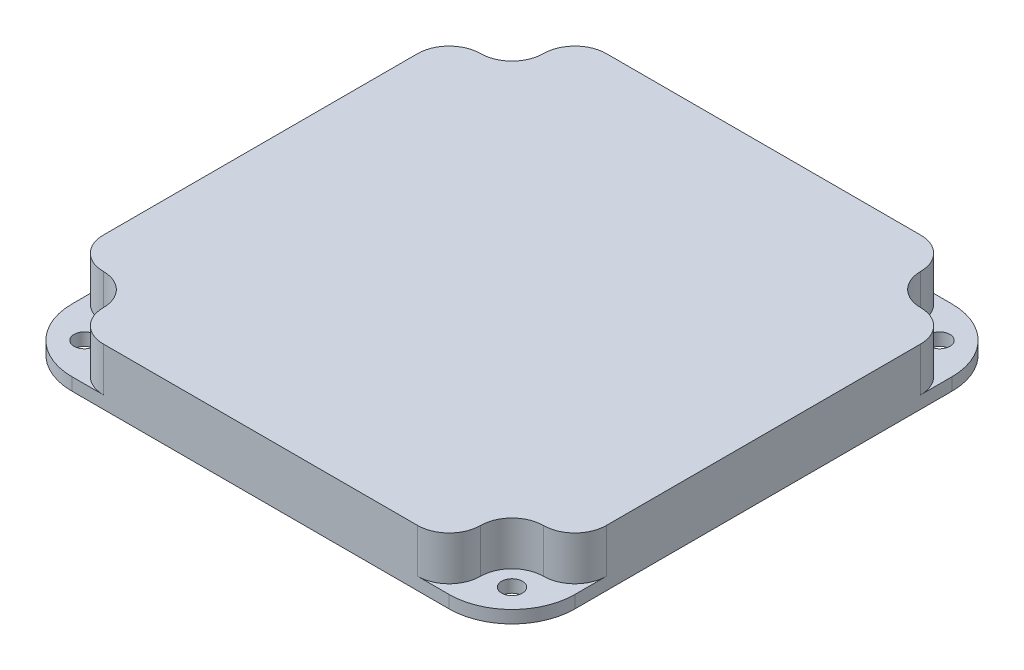
ISO-10303-21;
HEADER;
FILE_DESCRIPTION(('STEP AP214'),'2;1');
FILE_NAME('part.step','',(''),(''),'','','');
FILE_SCHEMA(('AUTOMOTIVE_DESIGN { 1 0 10303 214 1 1 1 1 }'));
ENDSEC;
DATA;
#1=APPLICATION_CONTEXT('core data for automotive mechanical design processes');
#2=APPLICATION_PROTOCOL_DEFINITION('international standard','automotive_design',2000,#1);
#3=PRODUCT_CONTEXT('',#1,'mechanical');
#4=PRODUCT('Part','Part','',(#3));
#5=PRODUCT_RELATED_PRODUCT_CATEGORY('part','',(#4));
#6=PRODUCT_DEFINITION_FORMATION('','',#4);
#7=PRODUCT_DEFINITION_CONTEXT('part definition',#1,'design');
#8=PRODUCT_DEFINITION('design','',#6,#7);
#9=PRODUCT_DEFINITION_SHAPE('','',#8);
#10=(LENGTH_UNIT() NAMED_UNIT(*) SI_UNIT(.MILLI.,.METRE.));
#11=(NAMED_UNIT(*) PLANE_ANGLE_UNIT() SI_UNIT($,.RADIAN.));
#12=(NAMED_UNIT(*) SI_UNIT($,.STERADIAN.) SOLID_ANGLE_UNIT());
#13=UNCERTAINTY_MEASURE_WITH_UNIT(LENGTH_MEASURE(1.E-05),#10,'distance_accuracy_value','');
#14=(GEOMETRIC_REPRESENTATION_CONTEXT(3) GLOBAL_UNCERTAINTY_ASSIGNED_CONTEXT((#13)) GLOBAL_UNIT_ASSIGNED_CONTEXT((#10,
#11,#12)) REPRESENTATION_CONTEXT('',''));
#15=CARTESIAN_POINT('',(0.,0.,0.));
#16=DIRECTION('',(0.,0.,1.));
#17=DIRECTION('',(1.,0.,0.));
#18=AXIS2_PLACEMENT_3D('',#15,#16,#17);
#19=CARTESIAN_POINT('',(-30.,2.,-30.));
#20=DIRECTION('',(0.,-1.,0.));
#21=DIRECTION('',(0.,0.,-1.));
#22=AXIS2_PLACEMENT_3D('',#19,#20,#21);
#23=PLANE('',#22);
#24=CARTESIAN_POINT('',(34.,2.,-34.));
#25=DIRECTION('',(0.,1.,0.));
#26=DIRECTION('',(0.,0.,-1.));
#27=AXIS2_PLACEMENT_3D('',#24,#25,#26);
#28=CIRCLE('',#27,1.65);
#29=CARTESIAN_POINT('',(34.,2.,-35.65));
#30=VERTEX_POINT('',#29);
#31=EDGE_CURVE('E374',#30,#30,#28,.T.);
#32=ORIENTED_EDGE('',*,*,#31,.F.);
#33=EDGE_LOOP('',(#32));
#34=FACE_BOUND('',#33,.T.);
#35=CARTESIAN_POINT('',(30.,2.,-30.));
#36=DIRECTION('',(0.,1.,0.));
#37=DIRECTION('',(0.,0.,-1.));
#38=AXIS2_PLACEMENT_3D('',#35,#36,#37);
#39=CIRCLE('',#38,10.);
#40=CARTESIAN_POINT('',(40.,2.,-29.9999999999999));
#41=VERTEX_POINT('',#40);
#42=CARTESIAN_POINT('',(29.9999999999999,2.,-40.));
#43=VERTEX_POINT('',#42);
#44=EDGE_CURVE('E394',#41,#43,#39,.T.);
#45=ORIENTED_EDGE('',*,*,#44,.T.);
#46=DIRECTION('',(1.,0.,0.));
#47=VECTOR('',#46,1.);
#48=CARTESIAN_POINT('',(-29.9999999999999,2.,-40.));
#49=LINE('',#48,#47);
#50=CARTESIAN_POINT('',(25.,2.,-40.));
#51=VERTEX_POINT('',#50);
#52=EDGE_CURVE('E263',#51,#43,#49,.T.);
#53=ORIENTED_EDGE('',*,*,#52,.F.);
#54=CARTESIAN_POINT('',(25.,2.,-35.));
#55=DIRECTION('',(0.,-1.,0.));
#56=DIRECTION('',(0.,0.,-1.));
#57=AXIS2_PLACEMENT_3D('',#54,#55,#56);
#58=CIRCLE('',#57,5.);
#59=CARTESIAN_POINT('',(30.,2.,-34.9999999999999));
#60=VERTEX_POINT('',#59);
#61=EDGE_CURVE('E301',#51,#60,#58,.T.);
#62=ORIENTED_EDGE('',*,*,#61,.T.);
#63=CARTESIAN_POINT('',(35.,2.,-35.));
#64=DIRECTION('',(0.,-1.,0.));
#65=DIRECTION('',(0.,0.,-1.));
#66=AXIS2_PLACEMENT_3D('',#63,#64,#65);
#67=CIRCLE('',#66,5.);
#68=CARTESIAN_POINT('',(34.9999999999999,2.,-30.));
#69=VERTEX_POINT('',#68);
#70=EDGE_CURVE('E271',#60,#69,#67,.F.);
#71=ORIENTED_EDGE('',*,*,#70,.T.);
#72=CARTESIAN_POINT('',(35.,2.,-25.));
#73=DIRECTION('',(0.,-1.,0.));
#74=DIRECTION('',(0.,0.,-1.));
#75=AXIS2_PLACEMENT_3D('',#72,#73,#74);
#76=CIRCLE('',#75,5.);
#77=CARTESIAN_POINT('',(40.,2.,-25.));
#78=VERTEX_POINT('',#77);
#79=EDGE_CURVE('E305',#69,#78,#76,.T.);
#80=ORIENTED_EDGE('',*,*,#79,.T.);
#81=DIRECTION('',(0.,0.,1.));
#82=VECTOR('',#81,1.);
#83=CARTESIAN_POINT('',(40.,2.,29.9999999999999));
#84=LINE('',#83,#82);
#85=EDGE_CURVE('E280',#41,#78,#84,.T.);
#86=ORIENTED_EDGE('',*,*,#85,.F.);
#87=EDGE_LOOP('',(#45,#53,#62,#71,#80,#86));
#88=FACE_BOUND('',#87,.T.);
#89=ADVANCED_FACE('F43',(#34,#88),#23,.F.);
#90=CARTESIAN_POINT('',(34.,2.,34.));
#91=DIRECTION('',(0.,1.,0.));
#92=DIRECTION('',(0.,0.,1.));
#93=AXIS2_PLACEMENT_3D('',#90,#91,#92);
#94=CIRCLE('',#93,1.65);
#95=CARTESIAN_POINT('',(34.,2.,35.65));
#96=VERTEX_POINT('',#95);
#97=EDGE_CURVE('E368',#96,#96,#94,.T.);
#98=ORIENTED_EDGE('',*,*,#97,.F.);
#99=EDGE_LOOP('',(#98));
#100=FACE_BOUND('',#99,.T.);
#101=CARTESIAN_POINT('',(30.,2.,30.));
#102=DIRECTION('',(0.,1.,0.));
#103=DIRECTION('',(0.,0.,1.));
#104=AXIS2_PLACEMENT_3D('',#101,#102,#103);
#105=CIRCLE('',#104,10.);
#106=CARTESIAN_POINT('',(29.9999999999999,2.,40.));
#107=VERTEX_POINT('',#106);
#108=CARTESIAN_POINT('',(40.,2.,29.9999999999999));
#109=VERTEX_POINT('',#108);
#110=EDGE_CURVE('E392',#107,#109,#105,.T.);
#111=ORIENTED_EDGE('',*,*,#110,.T.);
#112=DIRECTION('',(0.,0.,1.));
#113=VECTOR('',#112,1.);
#114=CARTESIAN_POINT('',(40.,2.,29.9999999999999));
#115=LINE('',#114,#113);
#116=CARTESIAN_POINT('',(40.,2.,25.));
#117=VERTEX_POINT('',#116);
#118=EDGE_CURVE('E273',#117,#109,#115,.T.);
#119=ORIENTED_EDGE('',*,*,#118,.F.);
#120=CARTESIAN_POINT('',(35.,2.,25.));
#121=DIRECTION('',(0.,-1.,0.));
#122=DIRECTION('',(0.,0.,-1.));
#123=AXIS2_PLACEMENT_3D('',#120,#121,#122);
#124=CIRCLE('',#123,5.);
#125=CARTESIAN_POINT('',(34.9999999999999,2.,30.));
#126=VERTEX_POINT('',#125);
#127=EDGE_CURVE('E307',#117,#126,#124,.T.);
#128=ORIENTED_EDGE('',*,*,#127,.T.);
#129=CARTESIAN_POINT('',(35.,2.,35.));
#130=DIRECTION('',(0.,-1.,0.));
#131=DIRECTION('',(0.,0.,-1.));
#132=AXIS2_PLACEMENT_3D('',#129,#130,#131);
#133=CIRCLE('',#132,5.);
#134=CARTESIAN_POINT('',(30.,2.,34.9999999999999));
#135=VERTEX_POINT('',#134);
#136=EDGE_CURVE('E283',#126,#135,#133,.F.);
#137=ORIENTED_EDGE('',*,*,#136,.T.);
#138=CARTESIAN_POINT('',(25.,2.,35.));
#139=DIRECTION('',(0.,-1.,0.));
#140=DIRECTION('',(0.,0.,-1.));
#141=AXIS2_PLACEMENT_3D('',#138,#139,#140);
#142=CIRCLE('',#141,5.);
#143=CARTESIAN_POINT('',(25.,2.,40.));
#144=VERTEX_POINT('',#143);
#145=EDGE_CURVE('E311',#135,#144,#142,.T.);
#146=ORIENTED_EDGE('',*,*,#145,.T.);
#147=DIRECTION('',(-1.,0.,0.));
#148=VECTOR('',#147,1.);
#149=CARTESIAN_POINT('',(-29.9999999999999,2.,40.));
#150=LINE('',#149,#148);
#151=EDGE_CURVE('E68',#107,#144,#150,.T.);
#152=ORIENTED_EDGE('',*,*,#151,.F.);
#153=EDGE_LOOP('',(#111,#119,#128,#137,#146,#152));
#154=FACE_BOUND('',#153,.T.);
#155=ADVANCED_FACE('F446',(#100,#154),#23,.F.);
#156=CARTESIAN_POINT('',(-34.,2.,34.));
#157=DIRECTION('',(0.,1.,0.));
#158=DIRECTION('',(0.,0.,-1.));
#159=AXIS2_PLACEMENT_3D('',#156,#157,#158);
#160=CIRCLE('',#159,1.65);
#161=CARTESIAN_POINT('',(-34.,2.,32.35));
#162=VERTEX_POINT('',#161);
#163=EDGE_CURVE('E380',#162,#162,#160,.T.);
#164=ORIENTED_EDGE('',*,*,#163,.F.);
#165=EDGE_LOOP('',(#164));
#166=FACE_BOUND('',#165,.T.);
#167=CARTESIAN_POINT('',(-30.,2.,30.));
#168=DIRECTION('',(0.,1.,0.));
#169=DIRECTION('',(0.,0.,-1.));
#170=AXIS2_PLACEMENT_3D('',#167,#168,#169);
#171=CIRCLE('',#170,10.);
#172=CARTESIAN_POINT('',(-40.,2.,29.9999999999999));
#173=VERTEX_POINT('',#172);
#174=CARTESIAN_POINT('',(-29.9999999999999,2.,40.));
#175=VERTEX_POINT('',#174);
#176=EDGE_CURVE('E227',#173,#175,#171,.T.);
#177=ORIENTED_EDGE('',*,*,#176,.T.);
#178=DIRECTION('',(-1.,0.,0.));
#179=VECTOR('',#178,1.);
#180=CARTESIAN_POINT('',(-29.9999999999999,2.,40.));
#181=LINE('',#180,#179);
#182=CARTESIAN_POINT('',(-25.,2.,40.));
#183=VERTEX_POINT('',#182);
#184=EDGE_CURVE('E285',#183,#175,#181,.T.);
#185=ORIENTED_EDGE('',*,*,#184,.F.);
#186=CARTESIAN_POINT('',(-25.,2.,35.));
#187=DIRECTION('',(0.,-1.,0.));
#188=DIRECTION('',(0.,0.,-1.));
#189=AXIS2_PLACEMENT_3D('',#186,#187,#188);
#190=CIRCLE('',#189,5.);
#191=CARTESIAN_POINT('',(-30.,2.,34.9999999999999));
#192=VERTEX_POINT('',#191);
#193=EDGE_CURVE('E11',#183,#192,#190,.T.);
#194=ORIENTED_EDGE('',*,*,#193,.T.);
#195=CARTESIAN_POINT('',(-35.,2.,35.));
#196=DIRECTION('',(0.,-1.,0.));
#197=DIRECTION('',(0.,0.,-1.));
#198=AXIS2_PLACEMENT_3D('',#195,#196,#197);
#199=CIRCLE('',#198,5.);
#200=CARTESIAN_POINT('',(-34.9999999999999,2.,30.));
#201=VERTEX_POINT('',#200);
#202=EDGE_CURVE('E293',#192,#201,#199,.F.);
#203=ORIENTED_EDGE('',*,*,#202,.T.);
#204=CARTESIAN_POINT('',(-35.,2.,25.));
#205=DIRECTION('',(0.,-1.,0.));
#206=DIRECTION('',(0.,0.,-1.));
#207=AXIS2_PLACEMENT_3D('',#204,#205,#206);
#208=CIRCLE('',#207,5.);
#209=CARTESIAN_POINT('',(-40.,2.,25.));
#210=VERTEX_POINT('',#209);
#211=EDGE_CURVE('E313',#201,#210,#208,.T.);
#212=ORIENTED_EDGE('',*,*,#211,.T.);
#213=DIRECTION('',(0.,0.,-1.));
#214=VECTOR('',#213,1.);
#215=CARTESIAN_POINT('',(-40.,2.,29.9999999999999));
#216=LINE('',#215,#214);
#217=EDGE_CURVE('E60',#173,#210,#216,.T.);
#218=ORIENTED_EDGE('',*,*,#217,.F.);
#219=EDGE_LOOP('',(#177,#185,#194,#203,#212,#218));
#220=FACE_BOUND('',#219,.T.);
#221=ADVANCED_FACE('F448',(#166,#220),#23,.F.);
#222=CARTESIAN_POINT('',(-34.,2.,-34.));
#223=DIRECTION('',(0.,1.,0.));
#224=DIRECTION('',(0.,0.,1.));
#225=AXIS2_PLACEMENT_3D('',#222,#223,#224);
#226=CIRCLE('',#225,1.65);
#227=CARTESIAN_POINT('',(-34.,2.,-32.35));
#228=VERTEX_POINT('',#227);
#229=EDGE_CURVE('E386',#228,#228,#226,.T.);
#230=ORIENTED_EDGE('',*,*,#229,.F.);
#231=EDGE_LOOP('',(#230));
#232=FACE_BOUND('',#231,.T.);
#233=CARTESIAN_POINT('',(-30.,2.,-30.));
#234=DIRECTION('',(0.,1.,0.));
#235=DIRECTION('',(0.,0.,-1.));
#236=AXIS2_PLACEMENT_3D('',#233,#234,#235);
#237=CIRCLE('',#236,10.);
#238=CARTESIAN_POINT('',(-29.9999999999999,2.,-40.));
#239=VERTEX_POINT('',#238);
#240=CARTESIAN_POINT('',(-40.,2.,-29.9999999999999));
#241=VERTEX_POINT('',#240);
#242=EDGE_CURVE('E220',#239,#241,#237,.T.);
#243=ORIENTED_EDGE('',*,*,#242,.T.);
#244=DIRECTION('',(0.,0.,-1.));
#245=VECTOR('',#244,1.);
#246=CARTESIAN_POINT('',(-40.,2.,29.9999999999999));
#247=LINE('',#246,#245);
#248=CARTESIAN_POINT('',(-40.,2.,-25.));
#249=VERTEX_POINT('',#248);
#250=EDGE_CURVE('E208',#249,#241,#247,.T.);
#251=ORIENTED_EDGE('',*,*,#250,.F.);
#252=CARTESIAN_POINT('',(-35.,2.,-25.));
#253=DIRECTION('',(0.,-1.,0.));
#254=DIRECTION('',(0.,0.,-1.));
#255=AXIS2_PLACEMENT_3D('',#252,#253,#254);
#256=CIRCLE('',#255,5.);
#257=CARTESIAN_POINT('',(-34.9999999999999,2.,-30.));
#258=VERTEX_POINT('',#257);
#259=EDGE_CURVE('E295',#249,#258,#256,.T.);
#260=ORIENTED_EDGE('',*,*,#259,.T.);
#261=CARTESIAN_POINT('',(-35.,2.,-35.));
#262=DIRECTION('',(0.,-1.,0.));
#263=DIRECTION('',(0.,0.,-1.));
#264=AXIS2_PLACEMENT_3D('',#261,#262,#263);
#265=CIRCLE('',#264,5.);
#266=CARTESIAN_POINT('',(-30.,2.,-34.9999999999999));
#267=VERTEX_POINT('',#266);
#268=EDGE_CURVE('E261',#258,#267,#265,.F.);
#269=ORIENTED_EDGE('',*,*,#268,.T.);
#270=CARTESIAN_POINT('',(-25.,2.,-35.));
#271=DIRECTION('',(0.,-1.,0.));
#272=DIRECTION('',(0.,0.,-1.));
#273=AXIS2_PLACEMENT_3D('',#270,#271,#272);
#274=CIRCLE('',#273,5.);
#275=CARTESIAN_POINT('',(-25.,2.,-40.));
#276=VERTEX_POINT('',#275);
#277=EDGE_CURVE('E299',#267,#276,#274,.T.);
#278=ORIENTED_EDGE('',*,*,#277,.T.);
#279=DIRECTION('',(1.,0.,0.));
#280=VECTOR('',#279,1.);
#281=CARTESIAN_POINT('',(-29.9999999999999,2.,-40.));
#282=LINE('',#281,#280);
#283=EDGE_CURVE('E223',#239,#276,#282,.T.);
#284=ORIENTED_EDGE('',*,*,#283,.F.);
#285=EDGE_LOOP('',(#243,#251,#260,#269,#278,#284));
#286=FACE_BOUND('',#285,.T.);
#287=ADVANCED_FACE('F221',(#232,#286),#23,.F.);
#288=CARTESIAN_POINT('',(-30.,0.,-30.));
#289=DIRECTION('',(0.,-1.,0.));
#290=DIRECTION('',(0.,0.,-1.));
#291=AXIS2_PLACEMENT_3D('',#288,#289,#290);
#292=PLANE('',#291);
#293=CARTESIAN_POINT('',(34.,0.,-34.));
#294=DIRECTION('',(0.,1.,0.));
#295=DIRECTION('',(0.,0.,-1.));
#296=AXIS2_PLACEMENT_3D('',#293,#294,#295);
#297=CIRCLE('',#296,1.65);
#298=CARTESIAN_POINT('',(34.,0.,-35.65));
#299=VERTEX_POINT('',#298);
#300=EDGE_CURVE('E371',#299,#299,#297,.T.);
#301=ORIENTED_EDGE('',*,*,#300,.T.);
#302=EDGE_LOOP('',(#301));
#303=FACE_BOUND('',#302,.T.);
#304=CARTESIAN_POINT('',(-34.,0.,-34.));
#305=DIRECTION('',(0.,1.,0.));
#306=DIRECTION('',(0.,0.,1.));
#307=AXIS2_PLACEMENT_3D('',#304,#305,#306);
#308=CIRCLE('',#307,1.65);
#309=CARTESIAN_POINT('',(-34.,0.,-32.35));
#310=VERTEX_POINT('',#309);
#311=EDGE_CURVE('E383',#310,#310,#308,.T.);
#312=ORIENTED_EDGE('',*,*,#311,.T.);
#313=EDGE_LOOP('',(#312));
#314=FACE_BOUND('',#313,.T.);
#315=CARTESIAN_POINT('',(-30.,0.,-30.));
#316=DIRECTION('',(0.,1.,0.));
#317=DIRECTION('',(0.,0.,-1.));
#318=AXIS2_PLACEMENT_3D('',#315,#316,#317);
#319=CIRCLE('',#318,10.);
#320=CARTESIAN_POINT('',(-29.9999999999999,0.,-40.));
#321=VERTEX_POINT('',#320);
#322=CARTESIAN_POINT('',(-40.,0.,-29.9999999999999));
#323=VERTEX_POINT('',#322);
#324=EDGE_CURVE('E232',#321,#323,#319,.T.);
#325=ORIENTED_EDGE('',*,*,#324,.F.);
#326=DIRECTION('',(-1.,0.,0.));
#327=VECTOR('',#326,1.);
#328=CARTESIAN_POINT('',(-29.9999999999999,0.,-40.));
#329=LINE('',#328,#327);
#330=CARTESIAN_POINT('',(29.9999999999999,0.,-40.));
#331=VERTEX_POINT('',#330);
#332=EDGE_CURVE('E228',#331,#321,#329,.T.);
#333=ORIENTED_EDGE('',*,*,#332,.F.);
#334=CARTESIAN_POINT('',(30.,0.,-30.));
#335=DIRECTION('',(0.,1.,0.));
#336=DIRECTION('',(0.,0.,-1.));
#337=AXIS2_PLACEMENT_3D('',#334,#335,#336);
#338=CIRCLE('',#337,10.);
#339=CARTESIAN_POINT('',(40.,0.,-29.9999999999999));
#340=VERTEX_POINT('',#339);
#341=EDGE_CURVE('E409',#340,#331,#338,.T.);
#342=ORIENTED_EDGE('',*,*,#341,.F.);
#343=DIRECTION('',(0.,0.,-1.));
#344=VECTOR('',#343,1.);
#345=CARTESIAN_POINT('',(40.,0.,29.9999999999999));
#346=LINE('',#345,#344);
#347=CARTESIAN_POINT('',(40.,0.,29.9999999999999));
#348=VERTEX_POINT('',#347);
#349=EDGE_CURVE('E407',#348,#340,#346,.T.);
#350=ORIENTED_EDGE('',*,*,#349,.F.);
#351=CARTESIAN_POINT('',(30.,0.,30.));
#352=DIRECTION('',(0.,1.,0.));
#353=DIRECTION('',(0.,0.,1.));
#354=AXIS2_PLACEMENT_3D('',#351,#352,#353);
#355=CIRCLE('',#354,10.);
#356=CARTESIAN_POINT('',(29.9999999999999,0.,40.));
#357=VERTEX_POINT('',#356);
#358=EDGE_CURVE('E405',#357,#348,#355,.T.);
#359=ORIENTED_EDGE('',*,*,#358,.F.);
#360=DIRECTION('',(1.,0.,0.));
#361=VECTOR('',#360,1.);
#362=CARTESIAN_POINT('',(-29.9999999999999,0.,40.));
#363=LINE('',#362,#361);
#364=CARTESIAN_POINT('',(-29.9999999999999,0.,40.));
#365=VERTEX_POINT('',#364);
#366=EDGE_CURVE('E403',#365,#357,#363,.T.);
#367=ORIENTED_EDGE('',*,*,#366,.F.);
#368=CARTESIAN_POINT('',(-30.,0.,30.));
#369=DIRECTION('',(0.,1.,0.));
#370=DIRECTION('',(0.,0.,-1.));
#371=AXIS2_PLACEMENT_3D('',#368,#369,#370);
#372=CIRCLE('',#371,10.);
#373=CARTESIAN_POINT('',(-40.,0.,29.9999999999999));
#374=VERTEX_POINT('',#373);
#375=EDGE_CURVE('E401',#374,#365,#372,.T.);
#376=ORIENTED_EDGE('',*,*,#375,.F.);
#377=DIRECTION('',(0.,0.,1.));
#378=VECTOR('',#377,1.);
#379=CARTESIAN_POINT('',(-40.,0.,29.9999999999999));
#380=LINE('',#379,#378);
#381=EDGE_CURVE('E399',#323,#374,#380,.T.);
#382=ORIENTED_EDGE('',*,*,#381,.F.);
#383=EDGE_LOOP('',(#325,#333,#342,#350,#359,#367,#376,#382));
#384=FACE_BOUND('',#383,.T.);
#385=CARTESIAN_POINT('',(-34.,0.,34.));
#386=DIRECTION('',(0.,1.,0.));
#387=DIRECTION('',(0.,0.,-1.));
#388=AXIS2_PLACEMENT_3D('',#385,#386,#387);
#389=CIRCLE('',#388,1.65);
#390=CARTESIAN_POINT('',(-34.,0.,32.35));
#391=VERTEX_POINT('',#390);
#392=EDGE_CURVE('E377',#391,#391,#389,.T.);
#393=ORIENTED_EDGE('',*,*,#392,.T.);
#394=EDGE_LOOP('',(#393));
#395=FACE_BOUND('',#394,.T.);
#396=CARTESIAN_POINT('',(34.,0.,34.));
#397=DIRECTION('',(0.,1.,0.));
#398=DIRECTION('',(0.,0.,1.));
#399=AXIS2_PLACEMENT_3D('',#396,#397,#398);
#400=CIRCLE('',#399,1.65);
#401=CARTESIAN_POINT('',(34.,0.,35.65));
#402=VERTEX_POINT('',#401);
#403=EDGE_CURVE('E362',#402,#402,#400,.T.);
#404=ORIENTED_EDGE('',*,*,#403,.T.);
#405=EDGE_LOOP('',(#404));
#406=FACE_BOUND('',#405,.T.);
#407=ADVANCED_FACE('F432',(#303,#314,#384,#395,#406),#292,.T.);
#408=CARTESIAN_POINT('',(-30.,2.,-30.));
#409=DIRECTION('',(0.,-1.,0.));
#410=DIRECTION('',(0.,0.,-1.));
#411=AXIS2_PLACEMENT_3D('',#408,#409,#410);
#412=CYLINDRICAL_SURFACE('',#411,10.);
#413=ORIENTED_EDGE('',*,*,#324,.T.);
#414=DIRECTION('',(0.,-1.,0.));
#415=VECTOR('',#414,1.);
#416=CARTESIAN_POINT('',(-40.,2.,-29.9999999999999));
#417=LINE('',#416,#415);
#418=EDGE_CURVE('E213',#241,#323,#417,.T.);
#419=ORIENTED_EDGE('',*,*,#418,.F.);
#420=ORIENTED_EDGE('',*,*,#242,.F.);
#421=DIRECTION('',(0.,-1.,0.));
#422=VECTOR('',#421,1.);
#423=CARTESIAN_POINT('',(-29.9999999999999,2.,-40.));
#424=LINE('',#423,#422);
#425=EDGE_CURVE('E397',#239,#321,#424,.T.);
#426=ORIENTED_EDGE('',*,*,#425,.T.);
#427=EDGE_LOOP('',(#413,#419,#420,#426));
#428=FACE_BOUND('',#427,.T.);
#429=ADVANCED_FACE('F230',(#428),#412,.T.);
#430=CARTESIAN_POINT('',(-40.,2.,29.9999999999999));
#431=DIRECTION('',(1.,0.,0.));
#432=DIRECTION('',(0.,0.,-1.));
#433=AXIS2_PLACEMENT_3D('',#430,#431,#432);
#434=PLANE('',#433);
#435=DIRECTION('',(0.,0.,1.));
#436=VECTOR('',#435,1.);
#437=CARTESIAN_POINT('',(-40.,9.,-29.9999999999999));
#438=LINE('',#437,#436);
#439=CARTESIAN_POINT('',(-40.,9.,-25.));
#440=VERTEX_POINT('',#439);
#441=CARTESIAN_POINT('',(-40.,9.,25.));
#442=VERTEX_POINT('',#441);
#443=EDGE_CURVE('E359',#440,#442,#438,.T.);
#444=ORIENTED_EDGE('',*,*,#443,.F.);
#445=DIRECTION('',(0.,-1.,0.));
#446=VECTOR('',#445,1.);
#447=CARTESIAN_POINT('',(-40.,2.,-25.));
#448=LINE('',#447,#446);
#449=EDGE_CURVE('E216',#440,#249,#448,.T.);
#450=ORIENTED_EDGE('',*,*,#449,.T.);
#451=ORIENTED_EDGE('',*,*,#250,.T.);
#452=ORIENTED_EDGE('',*,*,#418,.T.);
#453=ORIENTED_EDGE('',*,*,#381,.T.);
#454=DIRECTION('',(0.,-1.,0.));
#455=VECTOR('',#454,1.);
#456=CARTESIAN_POINT('',(-40.,2.,29.9999999999999));
#457=LINE('',#456,#455);
#458=EDGE_CURVE('E234',#173,#374,#457,.T.);
#459=ORIENTED_EDGE('',*,*,#458,.F.);
#460=ORIENTED_EDGE('',*,*,#217,.T.);
#461=DIRECTION('',(0.,-1.,0.));
#462=VECTOR('',#461,1.);
#463=CARTESIAN_POINT('',(-40.,2.,25.));
#464=LINE('',#463,#462);
#465=EDGE_CURVE('E233',#210,#442,#464,.F.);
#466=ORIENTED_EDGE('',*,*,#465,.T.);
#467=EDGE_LOOP('',(#444,#450,#451,#452,#453,#459,#460,#466));
#468=FACE_BOUND('',#467,.T.);
#469=ADVANCED_FACE('F211',(#468),#434,.F.);
#470=CARTESIAN_POINT('',(-30.,2.,30.));
#471=DIRECTION('',(0.,-1.,0.));
#472=DIRECTION('',(0.,0.,-1.));
#473=AXIS2_PLACEMENT_3D('',#470,#471,#472);
#474=CYLINDRICAL_SURFACE('',#473,10.);
#475=ORIENTED_EDGE('',*,*,#375,.T.);
#476=DIRECTION('',(0.,-1.,0.));
#477=VECTOR('',#476,1.);
#478=CARTESIAN_POINT('',(-29.9999999999999,2.,40.));
#479=LINE('',#478,#477);
#480=EDGE_CURVE('E239',#175,#365,#479,.T.);
#481=ORIENTED_EDGE('',*,*,#480,.F.);
#482=ORIENTED_EDGE('',*,*,#176,.F.);
#483=ORIENTED_EDGE('',*,*,#458,.T.);
#484=EDGE_LOOP('',(#475,#481,#482,#483));
#485=FACE_BOUND('',#484,.T.);
#486=ADVANCED_FACE('F479',(#485),#474,.T.);
#487=CARTESIAN_POINT('',(-29.9999999999999,2.,40.));
#488=DIRECTION('',(0.,0.,-1.));
#489=DIRECTION('',(-1.,0.,0.));
#490=AXIS2_PLACEMENT_3D('',#487,#488,#489);
#491=PLANE('',#490);
#492=DIRECTION('',(0.,-1.,0.));
#493=VECTOR('',#492,1.);
#494=CARTESIAN_POINT('',(29.9999999999999,2.,40.));
#495=LINE('',#494,#493);
#496=EDGE_CURVE('E422',#107,#357,#495,.T.);
#497=ORIENTED_EDGE('',*,*,#496,.F.);
#498=ORIENTED_EDGE('',*,*,#151,.T.);
#499=DIRECTION('',(0.,-1.,0.));
#500=VECTOR('',#499,1.);
#501=CARTESIAN_POINT('',(25.,2.,40.));
#502=LINE('',#501,#500);
#503=CARTESIAN_POINT('',(25.,9.,40.));
#504=VERTEX_POINT('',#503);
#505=EDGE_CURVE('E290',#144,#504,#502,.F.);
#506=ORIENTED_EDGE('',*,*,#505,.T.);
#507=DIRECTION('',(1.,0.,0.));
#508=VECTOR('',#507,1.);
#509=CARTESIAN_POINT('',(-29.9999999999999,9.,40.));
#510=LINE('',#509,#508);
#511=CARTESIAN_POINT('',(-25.,9.,40.));
#512=VERTEX_POINT('',#511);
#513=EDGE_CURVE('E353',#512,#504,#510,.T.);
#514=ORIENTED_EDGE('',*,*,#513,.F.);
#515=DIRECTION('',(0.,-1.,0.));
#516=VECTOR('',#515,1.);
#517=CARTESIAN_POINT('',(-25.,2.,40.));
#518=LINE('',#517,#516);
#519=EDGE_CURVE('E287',#512,#183,#518,.T.);
#520=ORIENTED_EDGE('',*,*,#519,.T.);
#521=ORIENTED_EDGE('',*,*,#184,.T.);
#522=ORIENTED_EDGE('',*,*,#480,.T.);
#523=ORIENTED_EDGE('',*,*,#366,.T.);
#524=EDGE_LOOP('',(#497,#498,#506,#514,#520,#521,#522,#523));
#525=FACE_BOUND('',#524,.T.);
#526=ADVANCED_FACE('F356',(#525),#491,.F.);
#527=CARTESIAN_POINT('',(30.,2.,30.));
#528=DIRECTION('',(0.,-1.,0.));
#529=DIRECTION('',(0.,0.,-1.));
#530=AXIS2_PLACEMENT_3D('',#527,#528,#529);
#531=CYLINDRICAL_SURFACE('',#530,10.);
#532=ORIENTED_EDGE('',*,*,#358,.T.);
#533=DIRECTION('',(0.,-1.,0.));
#534=VECTOR('',#533,1.);
#535=CARTESIAN_POINT('',(40.,2.,29.9999999999999));
#536=LINE('',#535,#534);
#537=EDGE_CURVE('E419',#109,#348,#536,.T.);
#538=ORIENTED_EDGE('',*,*,#537,.F.);
#539=ORIENTED_EDGE('',*,*,#110,.F.);
#540=ORIENTED_EDGE('',*,*,#496,.T.);
#541=EDGE_LOOP('',(#532,#538,#539,#540));
#542=FACE_BOUND('',#541,.T.);
#543=ADVANCED_FACE('F438',(#542),#531,.T.);
#544=CARTESIAN_POINT('',(40.,2.,29.9999999999999));
#545=DIRECTION('',(-1.,0.,0.));
#546=DIRECTION('',(0.,0.,1.));
#547=AXIS2_PLACEMENT_3D('',#544,#545,#546);
#548=PLANE('',#547);
#549=DIRECTION('',(0.,-1.,0.));
#550=VECTOR('',#549,1.);
#551=CARTESIAN_POINT('',(40.,2.,-29.9999999999999));
#552=LINE('',#551,#550);
#553=EDGE_CURVE('E416',#41,#340,#552,.T.);
#554=ORIENTED_EDGE('',*,*,#553,.F.);
#555=ORIENTED_EDGE('',*,*,#85,.T.);
#556=DIRECTION('',(0.,-1.,0.));
#557=VECTOR('',#556,1.);
#558=CARTESIAN_POINT('',(40.,2.,-25.));
#559=LINE('',#558,#557);
#560=CARTESIAN_POINT('',(40.,9.,-25.));
#561=VERTEX_POINT('',#560);
#562=EDGE_CURVE('E278',#78,#561,#559,.F.);
#563=ORIENTED_EDGE('',*,*,#562,.T.);
#564=DIRECTION('',(0.,0.,-1.));
#565=VECTOR('',#564,1.);
#566=CARTESIAN_POINT('',(40.,9.,29.9999999999999));
#567=LINE('',#566,#565);
#568=CARTESIAN_POINT('',(40.,9.,25.));
#569=VERTEX_POINT('',#568);
#570=EDGE_CURVE('E358',#569,#561,#567,.T.);
#571=ORIENTED_EDGE('',*,*,#570,.F.);
#572=DIRECTION('',(0.,-1.,0.));
#573=VECTOR('',#572,1.);
#574=CARTESIAN_POINT('',(40.,2.,25.));
#575=LINE('',#574,#573);
#576=EDGE_CURVE('E275',#569,#117,#575,.T.);
#577=ORIENTED_EDGE('',*,*,#576,.T.);
#578=ORIENTED_EDGE('',*,*,#118,.T.);
#579=ORIENTED_EDGE('',*,*,#537,.T.);
#580=ORIENTED_EDGE('',*,*,#349,.T.);
#581=EDGE_LOOP('',(#554,#555,#563,#571,#577,#578,#579,#580));
#582=FACE_BOUND('',#581,.T.);
#583=ADVANCED_FACE('F442',(#582),#548,.F.);
#584=CARTESIAN_POINT('',(30.,2.,-30.));
#585=DIRECTION('',(0.,-1.,0.));
#586=DIRECTION('',(0.,0.,-1.));
#587=AXIS2_PLACEMENT_3D('',#584,#585,#586);
#588=CYLINDRICAL_SURFACE('',#587,10.);
#589=ORIENTED_EDGE('',*,*,#341,.T.);
#590=DIRECTION('',(0.,-1.,0.));
#591=VECTOR('',#590,1.);
#592=CARTESIAN_POINT('',(29.9999999999999,2.,-40.));
#593=LINE('',#592,#591);
#594=EDGE_CURVE('E413',#43,#331,#593,.T.);
#595=ORIENTED_EDGE('',*,*,#594,.F.);
#596=ORIENTED_EDGE('',*,*,#44,.F.);
#597=ORIENTED_EDGE('',*,*,#553,.T.);
#598=EDGE_LOOP('',(#589,#595,#596,#597));
#599=FACE_BOUND('',#598,.T.);
#600=ADVANCED_FACE('F468',(#599),#588,.T.);
#601=CARTESIAN_POINT('',(-29.9999999999999,2.,-40.));
#602=DIRECTION('',(0.,0.,1.));
#603=DIRECTION('',(1.,0.,0.));
#604=AXIS2_PLACEMENT_3D('',#601,#602,#603);
#605=PLANE('',#604);
#606=ORIENTED_EDGE('',*,*,#425,.F.);
#607=ORIENTED_EDGE('',*,*,#283,.T.);
#608=DIRECTION('',(0.,-1.,0.));
#609=VECTOR('',#608,1.);
#610=CARTESIAN_POINT('',(-25.,2.,-40.));
#611=LINE('',#610,#609);
#612=CARTESIAN_POINT('',(-25.,9.,-40.));
#613=VERTEX_POINT('',#612);
#614=EDGE_CURVE('E268',#276,#613,#611,.F.);
#615=ORIENTED_EDGE('',*,*,#614,.T.);
#616=DIRECTION('',(-1.,0.,0.));
#617=VECTOR('',#616,1.);
#618=CARTESIAN_POINT('',(29.9999999999999,9.,-40.));
#619=LINE('',#618,#617);
#620=CARTESIAN_POINT('',(25.,9.,-40.));
#621=VERTEX_POINT('',#620);
#622=EDGE_CURVE('E323',#621,#613,#619,.T.);
#623=ORIENTED_EDGE('',*,*,#622,.F.);
#624=DIRECTION('',(0.,-1.,0.));
#625=VECTOR('',#624,1.);
#626=CARTESIAN_POINT('',(25.,2.,-40.));
#627=LINE('',#626,#625);
#628=EDGE_CURVE('E265',#621,#51,#627,.T.);
#629=ORIENTED_EDGE('',*,*,#628,.T.);
#630=ORIENTED_EDGE('',*,*,#52,.T.);
#631=ORIENTED_EDGE('',*,*,#594,.T.);
#632=ORIENTED_EDGE('',*,*,#332,.T.);
#633=EDGE_LOOP('',(#606,#607,#615,#623,#629,#630,#631,#632));
#634=FACE_BOUND('',#633,.T.);
#635=ADVANCED_FACE('F465',(#634),#605,.F.);
#636=CARTESIAN_POINT('',(-34.,2.,-34.));
#637=DIRECTION('',(0.,-1.,0.));
#638=DIRECTION('',(0.,0.,-1.));
#639=AXIS2_PLACEMENT_3D('',#636,#637,#638);
#640=CYLINDRICAL_SURFACE('',#639,1.65);
#641=ORIENTED_EDGE('',*,*,#229,.T.);
#642=EDGE_LOOP('',(#641));
#643=FACE_BOUND('',#642,.T.);
#644=ORIENTED_EDGE('',*,*,#311,.F.);
#645=EDGE_LOOP('',(#644));
#646=FACE_BOUND('',#645,.T.);
#647=ADVANCED_FACE('F460',(#643,#646),#640,.F.);
#648=CARTESIAN_POINT('',(-34.,2.,34.));
#649=DIRECTION('',(0.,-1.,0.));
#650=DIRECTION('',(0.,0.,-1.));
#651=AXIS2_PLACEMENT_3D('',#648,#649,#650);
#652=CYLINDRICAL_SURFACE('',#651,1.65);
#653=ORIENTED_EDGE('',*,*,#163,.T.);
#654=EDGE_LOOP('',(#653));
#655=FACE_BOUND('',#654,.T.);
#656=ORIENTED_EDGE('',*,*,#392,.F.);
#657=EDGE_LOOP('',(#656));
#658=FACE_BOUND('',#657,.T.);
#659=ADVANCED_FACE('F683',(#655,#658),#652,.F.);
#660=CARTESIAN_POINT('',(34.,2.,-34.));
#661=DIRECTION('',(0.,-1.,0.));
#662=DIRECTION('',(0.,0.,-1.));
#663=AXIS2_PLACEMENT_3D('',#660,#661,#662);
#664=CYLINDRICAL_SURFACE('',#663,1.65);
#665=ORIENTED_EDGE('',*,*,#31,.T.);
#666=EDGE_LOOP('',(#665));
#667=FACE_BOUND('',#666,.T.);
#668=ORIENTED_EDGE('',*,*,#300,.F.);
#669=EDGE_LOOP('',(#668));
#670=FACE_BOUND('',#669,.T.);
#671=ADVANCED_FACE('F675',(#667,#670),#664,.F.);
#672=CARTESIAN_POINT('',(34.,2.,34.));
#673=DIRECTION('',(0.,-1.,0.));
#674=DIRECTION('',(0.,0.,-1.));
#675=AXIS2_PLACEMENT_3D('',#672,#673,#674);
#676=CYLINDRICAL_SURFACE('',#675,1.65);
#677=ORIENTED_EDGE('',*,*,#97,.T.);
#678=EDGE_LOOP('',(#677));
#679=FACE_BOUND('',#678,.T.);
#680=ORIENTED_EDGE('',*,*,#403,.F.);
#681=EDGE_LOOP('',(#680));
#682=FACE_BOUND('',#681,.T.);
#683=ADVANCED_FACE('F581',(#679,#682),#676,.F.);
#684=CARTESIAN_POINT('',(0.,9.,0.));
#685=DIRECTION('',(0.,1.,0.));
#686=DIRECTION('',(0.,0.,1.));
#687=AXIS2_PLACEMENT_3D('',#684,#685,#686);
#688=PLANE('',#687);
#689=CARTESIAN_POINT('',(-25.,9.,-35.));
#690=DIRECTION('',(0.,1.,0.));
#691=DIRECTION('',(0.,0.,1.));
#692=AXIS2_PLACEMENT_3D('',#689,#690,#691);
#693=CIRCLE('',#692,5.);
#694=CARTESIAN_POINT('',(-30.,9.,-35.));
#695=VERTEX_POINT('',#694);
#696=EDGE_CURVE('E257',#613,#695,#693,.T.);
#697=ORIENTED_EDGE('',*,*,#696,.T.);
#698=CARTESIAN_POINT('',(-35.,9.,-35.));
#699=DIRECTION('',(0.,1.,0.));
#700=DIRECTION('',(0.,0.,1.));
#701=AXIS2_PLACEMENT_3D('',#698,#699,#700);
#702=CIRCLE('',#701,5.);
#703=CARTESIAN_POINT('',(-35.,9.,-30.));
#704=VERTEX_POINT('',#703);
#705=EDGE_CURVE('E297',#695,#704,#702,.F.);
#706=ORIENTED_EDGE('',*,*,#705,.T.);
#707=CARTESIAN_POINT('',(-35.,9.,-25.));
#708=DIRECTION('',(0.,1.,0.));
#709=DIRECTION('',(0.,0.,1.));
#710=AXIS2_PLACEMENT_3D('',#707,#708,#709);
#711=CIRCLE('',#710,5.);
#712=EDGE_CURVE('E259',#704,#440,#711,.T.);
#713=ORIENTED_EDGE('',*,*,#712,.T.);
#714=ORIENTED_EDGE('',*,*,#443,.T.);
#715=CARTESIAN_POINT('',(-35.,9.,25.));
#716=DIRECTION('',(0.,1.,0.));
#717=DIRECTION('',(0.,0.,1.));
#718=AXIS2_PLACEMENT_3D('',#715,#716,#717);
#719=CIRCLE('',#718,5.);
#720=CARTESIAN_POINT('',(-35.,9.,30.));
#721=VERTEX_POINT('',#720);
#722=EDGE_CURVE('E247',#442,#721,#719,.T.);
#723=ORIENTED_EDGE('',*,*,#722,.T.);
#724=CARTESIAN_POINT('',(-35.,9.,35.));
#725=DIRECTION('',(0.,1.,0.));
#726=DIRECTION('',(0.,0.,1.));
#727=AXIS2_PLACEMENT_3D('',#724,#725,#726);
#728=CIRCLE('',#727,5.);
#729=CARTESIAN_POINT('',(-30.,9.,35.));
#730=VERTEX_POINT('',#729);
#731=EDGE_CURVE('E52',#721,#730,#728,.F.);
#732=ORIENTED_EDGE('',*,*,#731,.T.);
#733=CARTESIAN_POINT('',(-25.,9.,35.));
#734=DIRECTION('',(0.,1.,0.));
#735=DIRECTION('',(0.,0.,1.));
#736=AXIS2_PLACEMENT_3D('',#733,#734,#735);
#737=CIRCLE('',#736,5.);
#738=EDGE_CURVE('E245',#730,#512,#737,.T.);
#739=ORIENTED_EDGE('',*,*,#738,.T.);
#740=ORIENTED_EDGE('',*,*,#513,.T.);
#741=CARTESIAN_POINT('',(25.,9.,35.));
#742=DIRECTION('',(0.,1.,0.));
#743=DIRECTION('',(0.,0.,1.));
#744=AXIS2_PLACEMENT_3D('',#741,#742,#743);
#745=CIRCLE('',#744,5.);
#746=CARTESIAN_POINT('',(30.,9.,35.));
#747=VERTEX_POINT('',#746);
#748=EDGE_CURVE('E249',#504,#747,#745,.T.);
#749=ORIENTED_EDGE('',*,*,#748,.T.);
#750=CARTESIAN_POINT('',(35.,9.,35.));
#751=DIRECTION('',(0.,1.,0.));
#752=DIRECTION('',(0.,0.,1.));
#753=AXIS2_PLACEMENT_3D('',#750,#751,#752);
#754=CIRCLE('',#753,5.);
#755=CARTESIAN_POINT('',(35.,9.,30.));
#756=VERTEX_POINT('',#755);
#757=EDGE_CURVE('E309',#747,#756,#754,.F.);
#758=ORIENTED_EDGE('',*,*,#757,.T.);
#759=CARTESIAN_POINT('',(35.,9.,25.));
#760=DIRECTION('',(0.,1.,0.));
#761=DIRECTION('',(0.,0.,1.));
#762=AXIS2_PLACEMENT_3D('',#759,#760,#761);
#763=CIRCLE('',#762,5.);
#764=EDGE_CURVE('E251',#756,#569,#763,.T.);
#765=ORIENTED_EDGE('',*,*,#764,.T.);
#766=ORIENTED_EDGE('',*,*,#570,.T.);
#767=CARTESIAN_POINT('',(35.,9.,-25.));
#768=DIRECTION('',(0.,1.,0.));
#769=DIRECTION('',(0.,0.,1.));
#770=AXIS2_PLACEMENT_3D('',#767,#768,#769);
#771=CIRCLE('',#770,5.);
#772=CARTESIAN_POINT('',(35.,9.,-30.));
#773=VERTEX_POINT('',#772);
#774=EDGE_CURVE('E253',#561,#773,#771,.T.);
#775=ORIENTED_EDGE('',*,*,#774,.T.);
#776=CARTESIAN_POINT('',(35.,9.,-35.));
#777=DIRECTION('',(0.,1.,0.));
#778=DIRECTION('',(0.,0.,1.));
#779=AXIS2_PLACEMENT_3D('',#776,#777,#778);
#780=CIRCLE('',#779,5.);
#781=CARTESIAN_POINT('',(30.,9.,-35.));
#782=VERTEX_POINT('',#781);
#783=EDGE_CURVE('E303',#773,#782,#780,.F.);
#784=ORIENTED_EDGE('',*,*,#783,.T.);
#785=CARTESIAN_POINT('',(25.,9.,-35.));
#786=DIRECTION('',(0.,1.,0.));
#787=DIRECTION('',(0.,0.,1.));
#788=AXIS2_PLACEMENT_3D('',#785,#786,#787);
#789=CIRCLE('',#788,5.);
#790=EDGE_CURVE('E255',#782,#621,#789,.T.);
#791=ORIENTED_EDGE('',*,*,#790,.T.);
#792=ORIENTED_EDGE('',*,*,#622,.T.);
#793=EDGE_LOOP('',(#697,#706,#713,#714,#723,#732,#739,#740,#749,#758,#765,#766,#775,#784,#791,#792));
#794=FACE_BOUND('',#793,.T.);
#795=ADVANCED_FACE('F352',(#794),#688,.T.);
#796=CARTESIAN_POINT('',(-25.,9.,-35.));
#797=DIRECTION('',(0.,-1.,0.));
#798=DIRECTION('',(0.,0.,-1.));
#799=AXIS2_PLACEMENT_3D('',#796,#797,#798);
#800=CYLINDRICAL_SURFACE('',#799,5.);
#801=ORIENTED_EDGE('',*,*,#614,.F.);
#802=ORIENTED_EDGE('',*,*,#277,.F.);
#803=DIRECTION('',(0.,-1.,0.));
#804=VECTOR('',#803,1.);
#805=CARTESIAN_POINT('',(-30.,9.,-35.));
#806=LINE('',#805,#804);
#807=EDGE_CURVE('E319',#695,#267,#806,.T.);
#808=ORIENTED_EDGE('',*,*,#807,.F.);
#809=ORIENTED_EDGE('',*,*,#696,.F.);
#810=EDGE_LOOP('',(#801,#802,#808,#809));
#811=FACE_BOUND('',#810,.T.);
#812=ADVANCED_FACE('F494',(#811),#800,.T.);
#813=CARTESIAN_POINT('',(-35.,9.,-35.));
#814=DIRECTION('',(0.,1.,0.));
#815=DIRECTION('',(0.,0.,1.));
#816=AXIS2_PLACEMENT_3D('',#813,#814,#815);
#817=CYLINDRICAL_SURFACE('',#816,5.);
#818=DIRECTION('',(0.,-1.,0.));
#819=VECTOR('',#818,1.);
#820=CARTESIAN_POINT('',(-34.9999999999999,2.,-30.));
#821=LINE('',#820,#819);
#822=EDGE_CURVE('E316',#704,#258,#821,.T.);
#823=ORIENTED_EDGE('',*,*,#822,.F.);
#824=ORIENTED_EDGE('',*,*,#705,.F.);
#825=ORIENTED_EDGE('',*,*,#807,.T.);
#826=ORIENTED_EDGE('',*,*,#268,.F.);
#827=EDGE_LOOP('',(#823,#824,#825,#826));
#828=FACE_BOUND('',#827,.T.);
#829=ADVANCED_FACE('F490',(#828),#817,.F.);
#830=CARTESIAN_POINT('',(-35.,2.,-25.));
#831=DIRECTION('',(0.,-1.,0.));
#832=DIRECTION('',(0.,0.,-1.));
#833=AXIS2_PLACEMENT_3D('',#830,#831,#832);
#834=CYLINDRICAL_SURFACE('',#833,5.);
#835=ORIENTED_EDGE('',*,*,#712,.F.);
#836=ORIENTED_EDGE('',*,*,#822,.T.);
#837=ORIENTED_EDGE('',*,*,#259,.F.);
#838=ORIENTED_EDGE('',*,*,#449,.F.);
#839=EDGE_LOOP('',(#835,#836,#837,#838));
#840=FACE_BOUND('',#839,.T.);
#841=ADVANCED_FACE('F486',(#840),#834,.T.);
#842=CARTESIAN_POINT('',(35.,9.,-25.));
#843=DIRECTION('',(0.,-1.,0.));
#844=DIRECTION('',(0.,0.,-1.));
#845=AXIS2_PLACEMENT_3D('',#842,#843,#844);
#846=CYLINDRICAL_SURFACE('',#845,5.);
#847=ORIENTED_EDGE('',*,*,#562,.F.);
#848=ORIENTED_EDGE('',*,*,#79,.F.);
#849=DIRECTION('',(0.,-1.,0.));
#850=VECTOR('',#849,1.);
#851=CARTESIAN_POINT('',(35.,9.,-30.));
#852=LINE('',#851,#850);
#853=EDGE_CURVE('E320',#773,#69,#852,.T.);
#854=ORIENTED_EDGE('',*,*,#853,.F.);
#855=ORIENTED_EDGE('',*,*,#774,.F.);
#856=EDGE_LOOP('',(#847,#848,#854,#855));
#857=FACE_BOUND('',#856,.T.);
#858=ADVANCED_FACE('F489',(#857),#846,.T.);
#859=CARTESIAN_POINT('',(35.,9.,-35.));
#860=DIRECTION('',(0.,1.,0.));
#861=DIRECTION('',(0.,0.,1.));
#862=AXIS2_PLACEMENT_3D('',#859,#860,#861);
#863=CYLINDRICAL_SURFACE('',#862,5.);
#864=DIRECTION('',(0.,-1.,0.));
#865=VECTOR('',#864,1.);
#866=CARTESIAN_POINT('',(30.,2.,-34.9999999999999));
#867=LINE('',#866,#865);
#868=EDGE_CURVE('E324',#782,#60,#867,.T.);
#869=ORIENTED_EDGE('',*,*,#868,.F.);
#870=ORIENTED_EDGE('',*,*,#783,.F.);
#871=ORIENTED_EDGE('',*,*,#853,.T.);
#872=ORIENTED_EDGE('',*,*,#70,.F.);
#873=EDGE_LOOP('',(#869,#870,#871,#872));
#874=FACE_BOUND('',#873,.T.);
#875=ADVANCED_FACE('F503',(#874),#863,.F.);
#876=CARTESIAN_POINT('',(25.,2.,-35.));
#877=DIRECTION('',(0.,-1.,0.));
#878=DIRECTION('',(0.,0.,-1.));
#879=AXIS2_PLACEMENT_3D('',#876,#877,#878);
#880=CYLINDRICAL_SURFACE('',#879,5.);
#881=ORIENTED_EDGE('',*,*,#790,.F.);
#882=ORIENTED_EDGE('',*,*,#868,.T.);
#883=ORIENTED_EDGE('',*,*,#61,.F.);
#884=ORIENTED_EDGE('',*,*,#628,.F.);
#885=EDGE_LOOP('',(#881,#882,#883,#884));
#886=FACE_BOUND('',#885,.T.);
#887=ADVANCED_FACE('F499',(#886),#880,.T.);
#888=CARTESIAN_POINT('',(25.,9.,35.));
#889=DIRECTION('',(0.,-1.,0.));
#890=DIRECTION('',(0.,0.,-1.));
#891=AXIS2_PLACEMENT_3D('',#888,#889,#890);
#892=CYLINDRICAL_SURFACE('',#891,5.);
#893=ORIENTED_EDGE('',*,*,#505,.F.);
#894=ORIENTED_EDGE('',*,*,#145,.F.);
#895=DIRECTION('',(0.,-1.,0.));
#896=VECTOR('',#895,1.);
#897=CARTESIAN_POINT('',(30.,9.,35.));
#898=LINE('',#897,#896);
#899=EDGE_CURVE('E327',#747,#135,#898,.T.);
#900=ORIENTED_EDGE('',*,*,#899,.F.);
#901=ORIENTED_EDGE('',*,*,#748,.F.);
#902=EDGE_LOOP('',(#893,#894,#900,#901));
#903=FACE_BOUND('',#902,.T.);
#904=ADVANCED_FACE('F502',(#903),#892,.T.);
#905=CARTESIAN_POINT('',(35.,9.,35.));
#906=DIRECTION('',(0.,1.,0.));
#907=DIRECTION('',(0.,0.,1.));
#908=AXIS2_PLACEMENT_3D('',#905,#906,#907);
#909=CYLINDRICAL_SURFACE('',#908,5.);
#910=DIRECTION('',(0.,-1.,0.));
#911=VECTOR('',#910,1.);
#912=CARTESIAN_POINT('',(34.9999999999999,2.,30.));
#913=LINE('',#912,#911);
#914=EDGE_CURVE('E330',#756,#126,#913,.T.);
#915=ORIENTED_EDGE('',*,*,#914,.F.);
#916=ORIENTED_EDGE('',*,*,#757,.F.);
#917=ORIENTED_EDGE('',*,*,#899,.T.);
#918=ORIENTED_EDGE('',*,*,#136,.F.);
#919=EDGE_LOOP('',(#915,#916,#917,#918));
#920=FACE_BOUND('',#919,.T.);
#921=ADVANCED_FACE('F514',(#920),#909,.F.);
#922=CARTESIAN_POINT('',(35.,2.,25.));
#923=DIRECTION('',(0.,-1.,0.));
#924=DIRECTION('',(0.,0.,-1.));
#925=AXIS2_PLACEMENT_3D('',#922,#923,#924);
#926=CYLINDRICAL_SURFACE('',#925,5.);
#927=ORIENTED_EDGE('',*,*,#764,.F.);
#928=ORIENTED_EDGE('',*,*,#914,.T.);
#929=ORIENTED_EDGE('',*,*,#127,.F.);
#930=ORIENTED_EDGE('',*,*,#576,.F.);
#931=EDGE_LOOP('',(#927,#928,#929,#930));
#932=FACE_BOUND('',#931,.T.);
#933=ADVANCED_FACE('F511',(#932),#926,.T.);
#934=CARTESIAN_POINT('',(-25.,2.,35.));
#935=DIRECTION('',(0.,-1.,0.));
#936=DIRECTION('',(0.,0.,-1.));
#937=AXIS2_PLACEMENT_3D('',#934,#935,#936);
#938=CYLINDRICAL_SURFACE('',#937,5.);
#939=ORIENTED_EDGE('',*,*,#519,.F.);
#940=ORIENTED_EDGE('',*,*,#738,.F.);
#941=DIRECTION('',(0.,-1.,0.));
#942=VECTOR('',#941,1.);
#943=CARTESIAN_POINT('',(-30.,9.,35.));
#944=LINE('',#943,#942);
#945=EDGE_CURVE('E47',#192,#730,#944,.F.);
#946=ORIENTED_EDGE('',*,*,#945,.F.);
#947=ORIENTED_EDGE('',*,*,#193,.F.);
#948=EDGE_LOOP('',(#939,#940,#946,#947));
#949=FACE_BOUND('',#948,.T.);
#950=ADVANCED_FACE('F45',(#949),#938,.T.);
#951=CARTESIAN_POINT('',(-35.,9.,35.));
#952=DIRECTION('',(0.,1.,0.));
#953=DIRECTION('',(0.,0.,1.));
#954=AXIS2_PLACEMENT_3D('',#951,#952,#953);
#955=CYLINDRICAL_SURFACE('',#954,5.);
#956=ORIENTED_EDGE('',*,*,#945,.T.);
#957=ORIENTED_EDGE('',*,*,#731,.F.);
#958=DIRECTION('',(0.,-1.,0.));
#959=VECTOR('',#958,1.);
#960=CARTESIAN_POINT('',(-34.9999999999999,9.,30.));
#961=LINE('',#960,#959);
#962=EDGE_CURVE('E334',#201,#721,#961,.F.);
#963=ORIENTED_EDGE('',*,*,#962,.F.);
#964=ORIENTED_EDGE('',*,*,#202,.F.);
#965=EDGE_LOOP('',(#956,#957,#963,#964));
#966=FACE_BOUND('',#965,.T.);
#967=ADVANCED_FACE('F344',(#966),#955,.F.);
#968=CARTESIAN_POINT('',(-35.,9.,25.));
#969=DIRECTION('',(0.,-1.,0.));
#970=DIRECTION('',(0.,0.,-1.));
#971=AXIS2_PLACEMENT_3D('',#968,#969,#970);
#972=CYLINDRICAL_SURFACE('',#971,5.);
#973=ORIENTED_EDGE('',*,*,#722,.F.);
#974=ORIENTED_EDGE('',*,*,#465,.F.);
#975=ORIENTED_EDGE('',*,*,#211,.F.);
#976=ORIENTED_EDGE('',*,*,#962,.T.);
#977=EDGE_LOOP('',(#973,#974,#975,#976));
#978=FACE_BOUND('',#977,.T.);
#979=ADVANCED_FACE('F522',(#978),#972,.T.);
#980=CLOSED_SHELL('',(#89,#155,#221,#287,#407,#429,#469,#486,#526,#543,#583,#600,#635,#647,#659,
#671,#683,#795,#812,#829,#841,#858,#875,#887,#904,#921,#933,#950,#967,#979));
#981=MANIFOLD_SOLID_BREP('B2',#980);
#982=ADVANCED_BREP_SHAPE_REPRESENTATION('',(#18,#981),#14);
#983=SHAPE_DEFINITION_REPRESENTATION(#9,#982);
ENDSEC;
END-ISO-10303-21;
